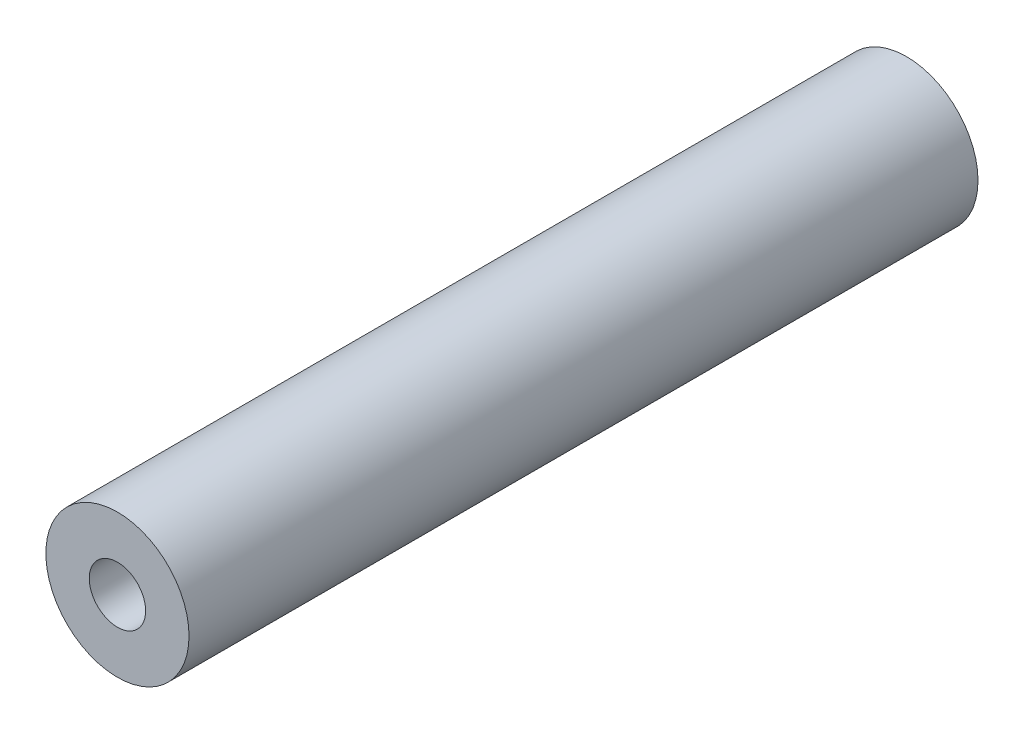
ISO-10303-21;
HEADER;
FILE_DESCRIPTION(('STEP AP214'),'2;1');
FILE_NAME('part.step','',(''),(''),'','','');
FILE_SCHEMA(('AUTOMOTIVE_DESIGN { 1 0 10303 214 1 1 1 1 }'));
ENDSEC;
DATA;
#1=APPLICATION_CONTEXT('core data for automotive mechanical design processes');
#2=APPLICATION_PROTOCOL_DEFINITION('international standard','automotive_design',2000,#1);
#3=PRODUCT_CONTEXT('',#1,'mechanical');
#4=PRODUCT('Part','Part','',(#3));
#5=PRODUCT_RELATED_PRODUCT_CATEGORY('part','',(#4));
#6=PRODUCT_DEFINITION_FORMATION('','',#4);
#7=PRODUCT_DEFINITION_CONTEXT('part definition',#1,'design');
#8=PRODUCT_DEFINITION('design','',#6,#7);
#9=PRODUCT_DEFINITION_SHAPE('','',#8);
#10=(LENGTH_UNIT() NAMED_UNIT(*) SI_UNIT(.MILLI.,.METRE.));
#11=(NAMED_UNIT(*) PLANE_ANGLE_UNIT() SI_UNIT($,.RADIAN.));
#12=(NAMED_UNIT(*) SI_UNIT($,.STERADIAN.) SOLID_ANGLE_UNIT());
#13=UNCERTAINTY_MEASURE_WITH_UNIT(LENGTH_MEASURE(1.E-05),#10,'distance_accuracy_value','');
#14=(GEOMETRIC_REPRESENTATION_CONTEXT(3) GLOBAL_UNCERTAINTY_ASSIGNED_CONTEXT((#13)) GLOBAL_UNIT_ASSIGNED_CONTEXT((#10,
#11,#12)) REPRESENTATION_CONTEXT('',''));
#15=CARTESIAN_POINT('',(0.,0.,0.));
#16=DIRECTION('',(0.,0.,1.));
#17=DIRECTION('',(1.,0.,0.));
#18=AXIS2_PLACEMENT_3D('',#15,#16,#17);
#19=CARTESIAN_POINT('',(0.,0.,0.));
#20=DIRECTION('',(0.,0.,1.));
#21=DIRECTION('',(1.,0.,0.));
#22=AXIS2_PLACEMENT_3D('',#19,#20,#21);
#23=CYLINDRICAL_SURFACE('',#22,1.25);
#24=CARTESIAN_POINT('',(0.,0.,35.));
#25=DIRECTION('',(0.,0.,1.));
#26=DIRECTION('',(1.,0.,0.));
#27=AXIS2_PLACEMENT_3D('',#24,#25,#26);
#28=CIRCLE('',#27,1.25);
#29=CARTESIAN_POINT('',(1.25,0.,35.));
#30=VERTEX_POINT('',#29);
#31=EDGE_CURVE('E22',#30,#30,#28,.T.);
#32=ORIENTED_EDGE('',*,*,#31,.T.);
#33=EDGE_LOOP('',(#32));
#34=FACE_BOUND('',#33,.T.);
#35=CARTESIAN_POINT('',(0.,0.,0.));
#36=DIRECTION('',(0.,0.,1.));
#37=DIRECTION('',(1.,0.,0.));
#38=AXIS2_PLACEMENT_3D('',#35,#36,#37);
#39=CIRCLE('',#38,1.25);
#40=CARTESIAN_POINT('',(1.25,0.,0.));
#41=VERTEX_POINT('',#40);
#42=EDGE_CURVE('E10',#41,#41,#39,.T.);
#43=ORIENTED_EDGE('',*,*,#42,.F.);
#44=EDGE_LOOP('',(#43));
#45=FACE_BOUND('',#44,.T.);
#46=ADVANCED_FACE('F15',(#34,#45),#23,.F.);
#47=CARTESIAN_POINT('',(0.,0.,0.));
#48=DIRECTION('',(0.,0.,1.));
#49=DIRECTION('',(1.,0.,0.));
#50=AXIS2_PLACEMENT_3D('',#47,#48,#49);
#51=PLANE('',#50);
#52=ORIENTED_EDGE('',*,*,#42,.T.);
#53=EDGE_LOOP('',(#52));
#54=FACE_BOUND('',#53,.T.);
#55=CARTESIAN_POINT('',(0.,0.,0.));
#56=DIRECTION('',(0.,0.,1.));
#57=DIRECTION('',(1.,0.,0.));
#58=AXIS2_PLACEMENT_3D('',#55,#56,#57);
#59=CIRCLE('',#58,3.175426480543);
#60=CARTESIAN_POINT('',(3.175426480543,0.,0.));
#61=VERTEX_POINT('',#60);
#62=EDGE_CURVE('E30',#61,#61,#59,.T.);
#63=ORIENTED_EDGE('',*,*,#62,.F.);
#64=EDGE_LOOP('',(#63));
#65=FACE_BOUND('',#64,.T.);
#66=ADVANCED_FACE('F52',(#54,#65),#51,.F.);
#67=CARTESIAN_POINT('',(0.,0.,35.));
#68=DIRECTION('',(0.,0.,1.));
#69=DIRECTION('',(1.,0.,0.));
#70=AXIS2_PLACEMENT_3D('',#67,#68,#69);
#71=PLANE('',#70);
#72=ORIENTED_EDGE('',*,*,#31,.F.);
#73=EDGE_LOOP('',(#72));
#74=FACE_BOUND('',#73,.T.);
#75=CARTESIAN_POINT('',(0.,0.,35.));
#76=DIRECTION('',(0.,0.,1.));
#77=DIRECTION('',(1.,0.,0.));
#78=AXIS2_PLACEMENT_3D('',#75,#76,#77);
#79=CIRCLE('',#78,3.175426480543);
#80=CARTESIAN_POINT('',(3.175426480543,0.,35.));
#81=VERTEX_POINT('',#80);
#82=EDGE_CURVE('E36',#81,#81,#79,.T.);
#83=ORIENTED_EDGE('',*,*,#82,.T.);
#84=EDGE_LOOP('',(#83));
#85=FACE_BOUND('',#84,.T.);
#86=ADVANCED_FACE('F44',(#74,#85),#71,.T.);
#87=CARTESIAN_POINT('',(0.,0.,0.));
#88=DIRECTION('',(0.,0.,1.));
#89=DIRECTION('',(1.,0.,0.));
#90=AXIS2_PLACEMENT_3D('',#87,#88,#89);
#91=CYLINDRICAL_SURFACE('',#90,3.175426480543);
#92=ORIENTED_EDGE('',*,*,#82,.F.);
#93=EDGE_LOOP('',(#92));
#94=FACE_BOUND('',#93,.T.);
#95=ORIENTED_EDGE('',*,*,#62,.T.);
#96=EDGE_LOOP('',(#95));
#97=FACE_BOUND('',#96,.T.);
#98=ADVANCED_FACE('F46',(#94,#97),#91,.T.);
#99=CLOSED_SHELL('',(#46,#66,#86,#98));
#100=MANIFOLD_SOLID_BREP('B1',#99);
#101=ADVANCED_BREP_SHAPE_REPRESENTATION('',(#18,#100),#14);
#102=SHAPE_DEFINITION_REPRESENTATION(#9,#101);
ENDSEC;
END-ISO-10303-21;
